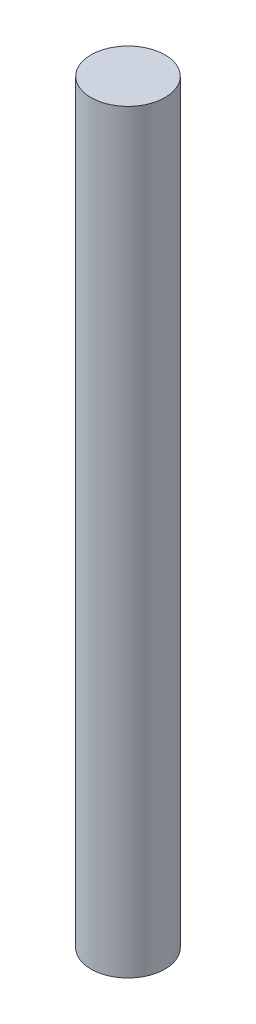
ISO-10303-21;
HEADER;
FILE_DESCRIPTION(('STEP AP214'),'2;1');
FILE_NAME('part.step','',(''),(''),'','','');
FILE_SCHEMA(('AUTOMOTIVE_DESIGN { 1 0 10303 214 1 1 1 1 }'));
ENDSEC;
DATA;
#1=APPLICATION_CONTEXT('core data for automotive mechanical design processes');
#2=APPLICATION_PROTOCOL_DEFINITION('international standard','automotive_design',2000,#1);
#3=PRODUCT_CONTEXT('',#1,'mechanical');
#4=PRODUCT('Part','Part','',(#3));
#5=PRODUCT_RELATED_PRODUCT_CATEGORY('part','',(#4));
#6=PRODUCT_DEFINITION_FORMATION('','',#4);
#7=PRODUCT_DEFINITION_CONTEXT('part definition',#1,'design');
#8=PRODUCT_DEFINITION('design','',#6,#7);
#9=PRODUCT_DEFINITION_SHAPE('','',#8);
#10=(LENGTH_UNIT() NAMED_UNIT(*) SI_UNIT(.MILLI.,.METRE.));
#11=(NAMED_UNIT(*) PLANE_ANGLE_UNIT() SI_UNIT($,.RADIAN.));
#12=(NAMED_UNIT(*) SI_UNIT($,.STERADIAN.) SOLID_ANGLE_UNIT());
#13=UNCERTAINTY_MEASURE_WITH_UNIT(LENGTH_MEASURE(1.E-05),#10,'distance_accuracy_value','');
#14=(GEOMETRIC_REPRESENTATION_CONTEXT(3) GLOBAL_UNCERTAINTY_ASSIGNED_CONTEXT((#13)) GLOBAL_UNIT_ASSIGNED_CONTEXT((#10,
#11,#12)) REPRESENTATION_CONTEXT('',''));
#15=CARTESIAN_POINT('',(0.,0.,0.));
#16=DIRECTION('',(0.,0.,1.));
#17=DIRECTION('',(1.,0.,0.));
#18=AXIS2_PLACEMENT_3D('',#15,#16,#17);
#19=CARTESIAN_POINT('',(0.,200.,0.));
#20=DIRECTION('',(0.,-1.,0.));
#21=DIRECTION('',(0.,0.,-1.));
#22=AXIS2_PLACEMENT_3D('',#19,#20,#21);
#23=CYLINDRICAL_SURFACE('',#22,9.8);
#24=CARTESIAN_POINT('',(0.,200.,0.));
#25=DIRECTION('',(0.,1.,0.));
#26=DIRECTION('',(0.,0.,1.));
#27=AXIS2_PLACEMENT_3D('',#24,#25,#26);
#28=CIRCLE('',#27,9.8);
#29=CARTESIAN_POINT('',(0.,200.,9.8));
#30=VERTEX_POINT('',#29);
#31=EDGE_CURVE('E10',#30,#30,#28,.T.);
#32=ORIENTED_EDGE('',*,*,#31,.F.);
#33=EDGE_LOOP('',(#32));
#34=FACE_BOUND('',#33,.T.);
#35=CARTESIAN_POINT('',(0.,0.,0.));
#36=DIRECTION('',(0.,1.,0.));
#37=DIRECTION('',(0.,0.,1.));
#38=AXIS2_PLACEMENT_3D('',#35,#36,#37);
#39=CIRCLE('',#38,9.8);
#40=CARTESIAN_POINT('',(0.,0.,9.8));
#41=VERTEX_POINT('',#40);
#42=EDGE_CURVE('E46',#41,#41,#39,.T.);
#43=ORIENTED_EDGE('',*,*,#42,.T.);
#44=EDGE_LOOP('',(#43));
#45=FACE_BOUND('',#44,.T.);
#46=ADVANCED_FACE('F43',(#34,#45),#23,.T.);
#47=CARTESIAN_POINT('',(0.,200.,0.));
#48=DIRECTION('',(0.,1.,0.));
#49=DIRECTION('',(0.,0.,1.));
#50=AXIS2_PLACEMENT_3D('',#47,#48,#49);
#51=PLANE('',#50);
#52=ORIENTED_EDGE('',*,*,#31,.T.);
#53=EDGE_LOOP('',(#52));
#54=FACE_BOUND('',#53,.T.);
#55=ADVANCED_FACE('F60',(#54),#51,.T.);
#56=CARTESIAN_POINT('',(0.,0.,0.));
#57=DIRECTION('',(0.,1.,0.));
#58=DIRECTION('',(0.,0.,1.));
#59=AXIS2_PLACEMENT_3D('',#56,#57,#58);
#60=PLANE('',#59);
#61=ORIENTED_EDGE('',*,*,#42,.F.);
#62=EDGE_LOOP('',(#61));
#63=FACE_BOUND('',#62,.T.);
#64=ADVANCED_FACE('F58',(#63),#60,.F.);
#65=CLOSED_SHELL('',(#46,#55,#64));
#66=MANIFOLD_SOLID_BREP('B2',#65);
#67=ADVANCED_BREP_SHAPE_REPRESENTATION('',(#18,#66),#14);
#68=SHAPE_DEFINITION_REPRESENTATION(#9,#67);
ENDSEC;
END-ISO-10303-21;
